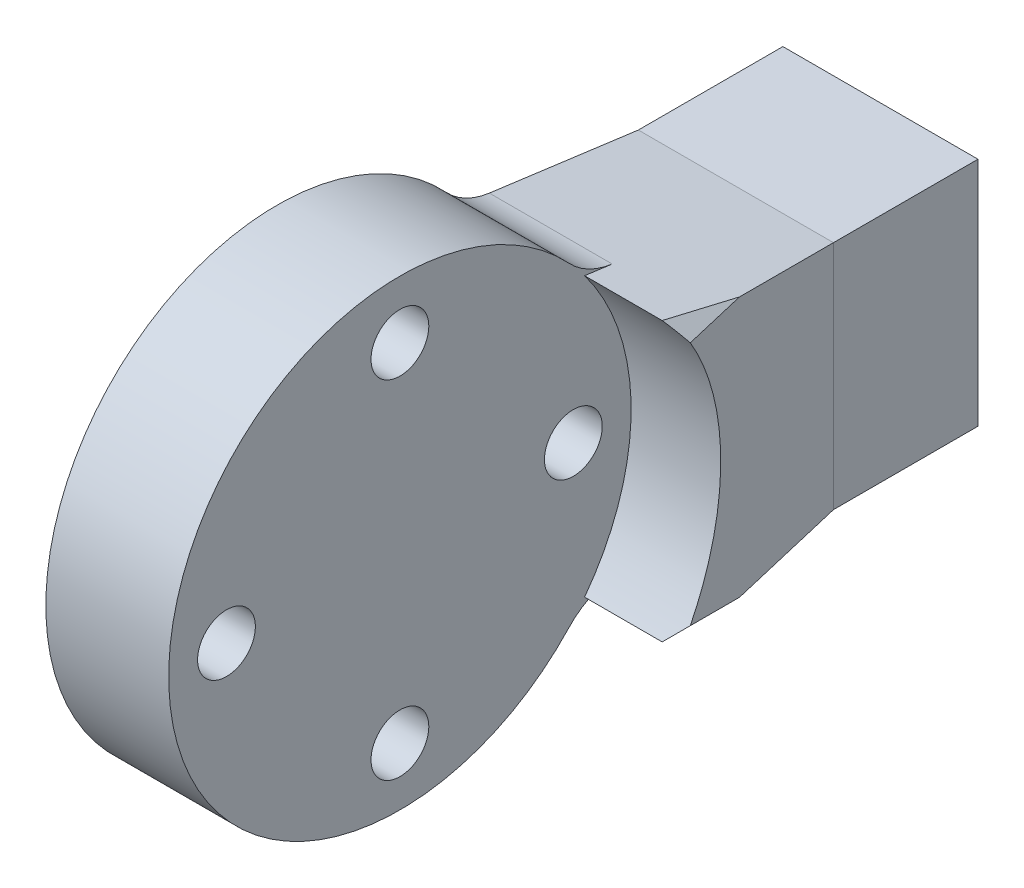
ISO-10303-21;
HEADER;
FILE_DESCRIPTION(('STEP AP214'),'2;1');
FILE_NAME('part.step','',(''),(''),'','','');
FILE_SCHEMA(('AUTOMOTIVE_DESIGN { 1 0 10303 214 1 1 1 1 }'));
ENDSEC;
DATA;
#1=APPLICATION_CONTEXT('core data for automotive mechanical design processes');
#2=APPLICATION_PROTOCOL_DEFINITION('international standard','automotive_design',2000,#1);
#3=PRODUCT_CONTEXT('',#1,'mechanical');
#4=PRODUCT('Part','Part','',(#3));
#5=PRODUCT_RELATED_PRODUCT_CATEGORY('part','',(#4));
#6=PRODUCT_DEFINITION_FORMATION('','',#4);
#7=PRODUCT_DEFINITION_CONTEXT('part definition',#1,'design');
#8=PRODUCT_DEFINITION('design','',#6,#7);
#9=PRODUCT_DEFINITION_SHAPE('','',#8);
#10=(LENGTH_UNIT() NAMED_UNIT(*) SI_UNIT(.MILLI.,.METRE.));
#11=(NAMED_UNIT(*) PLANE_ANGLE_UNIT() SI_UNIT($,.RADIAN.));
#12=(NAMED_UNIT(*) SI_UNIT($,.STERADIAN.) SOLID_ANGLE_UNIT());
#13=UNCERTAINTY_MEASURE_WITH_UNIT(LENGTH_MEASURE(1.E-05),#10,'distance_accuracy_value','');
#14=(GEOMETRIC_REPRESENTATION_CONTEXT(3) GLOBAL_UNCERTAINTY_ASSIGNED_CONTEXT((#13)) GLOBAL_UNIT_ASSIGNED_CONTEXT((#10,
#11,#12)) REPRESENTATION_CONTEXT('',''));
#15=CARTESIAN_POINT('',(0.,0.,0.));
#16=DIRECTION('',(0.,0.,1.));
#17=DIRECTION('',(1.,0.,0.));
#18=AXIS2_PLACEMENT_3D('',#15,#16,#17);
#19=CARTESIAN_POINT('',(16.,10.,-9.99999999999961));
#20=DIRECTION('',(0.,-0.991227900682635,0.132163720091015));
#21=DIRECTION('',(-1.,0.,0.));
#22=AXIS2_PLACEMENT_3D('',#19,#20,#21);
#23=PLANE('',#22);
#24=DIRECTION('',(1.,0.,0.));
#25=VECTOR('',#24,1.);
#26=CARTESIAN_POINT('',(16.,8.,-25.));
#27=LINE('',#26,#25);
#28=CARTESIAN_POINT('',(0.5,8.,-25.));
#29=VERTEX_POINT('',#28);
#30=CARTESIAN_POINT('',(14.,8.,-25.));
#31=VERTEX_POINT('',#30);
#32=EDGE_CURVE('E212',#29,#31,#27,.T.);
#33=ORIENTED_EDGE('',*,*,#32,.F.);
#34=DIRECTION('',(0.,-0.132163720091015,-0.991227900682635));
#35=VECTOR('',#34,1.);
#36=CARTESIAN_POINT('',(0.5,9.37476407572791,-14.6892694320404));
#37=LINE('',#36,#35);
#38=CARTESIAN_POINT('',(0.5,9.37476407572791,-14.6892694320404));
#39=VERTEX_POINT('',#38);
#40=EDGE_CURVE('E275',#39,#29,#37,.T.);
#41=ORIENTED_EDGE('',*,*,#40,.F.);
#42=DIRECTION('',(1.,0.,0.));
#43=VECTOR('',#42,1.);
#44=CARTESIAN_POINT('',(9.,9.37476407572791,-14.6892694320404));
#45=LINE('',#44,#43);
#46=CARTESIAN_POINT('',(9.,9.37476407572791,-14.6892694320404));
#47=VERTEX_POINT('',#46);
#48=EDGE_CURVE('E55',#39,#47,#45,.T.);
#49=ORIENTED_EDGE('',*,*,#48,.T.);
#50=DIRECTION('',(0.,-0.132163720091015,-0.991227900682635));
#51=VECTOR('',#50,1.);
#52=CARTESIAN_POINT('',(9.,11.1353711790392,-1.48471615720519));
#53=LINE('',#52,#51);
#54=CARTESIAN_POINT('',(9.,9.62963758604953,-12.7777181046281));
#55=VERTEX_POINT('',#54);
#56=EDGE_CURVE('E170',#47,#55,#53,.F.);
#57=ORIENTED_EDGE('',*,*,#56,.T.);
#58=DIRECTION('',(1.,0.,0.));
#59=VECTOR('',#58,1.);
#60=CARTESIAN_POINT('',(9.,9.62963758604954,-12.7777181046281));
#61=LINE('',#60,#59);
#62=CARTESIAN_POINT('',(14.3703624139505,9.62963758604954,-12.7777181046282));
#63=VERTEX_POINT('',#62);
#64=EDGE_CURVE('E175',#63,#55,#61,.F.);
#65=ORIENTED_EDGE('',*,*,#64,.F.);
#66=DIRECTION('',(0.13102435641608,-0.131024356416081,-0.982682673120629));
#67=VECTOR('',#66,1.);
#68=CARTESIAN_POINT('',(14.0343347639485,9.9656652360515,-10.2575107296133));
#69=LINE('',#68,#67);
#70=CARTESIAN_POINT('',(15.,9.,-17.4999999999998));
#71=VERTEX_POINT('',#70);
#72=EDGE_CURVE('E218',#63,#71,#69,.T.);
#73=ORIENTED_EDGE('',*,*,#72,.T.);
#74=DIRECTION('',(0.13102435641608,0.13102435641608,0.982682673120628));
#75=VECTOR('',#74,1.);
#76=CARTESIAN_POINT('',(13.862660944206,7.86266094420601,-26.0300429184549));
#77=LINE('',#76,#75);
#78=EDGE_CURVE('E213',#31,#71,#77,.T.);
#79=ORIENTED_EDGE('',*,*,#78,.F.);
#80=EDGE_LOOP('',(#33,#41,#49,#57,#65,#73,#79));
#81=FACE_BOUND('',#80,.T.);
#82=ADVANCED_FACE('F47',(#81),#23,.F.);
#83=CARTESIAN_POINT('',(16.,-8.,-25.));
#84=DIRECTION('',(0.,-0.991227900682635,-0.132163720091015));
#85=DIRECTION('',(1.,0.,0.));
#86=AXIS2_PLACEMENT_3D('',#83,#84,#85);
#87=PLANE('',#86);
#88=DIRECTION('',(-1.,0.,0.));
#89=VECTOR('',#88,1.);
#90=CARTESIAN_POINT('',(0.,-9.37476407572791,-14.6892694320404));
#91=LINE('',#90,#89);
#92=CARTESIAN_POINT('',(9.,-9.37476407572791,-14.6892694320404));
#93=VERTEX_POINT('',#92);
#94=CARTESIAN_POINT('',(0.5,-9.37476407572791,-14.6892694320404));
#95=VERTEX_POINT('',#94);
#96=EDGE_CURVE('E157',#93,#95,#91,.T.);
#97=ORIENTED_EDGE('',*,*,#96,.T.);
#98=DIRECTION('',(0.,-0.132163720091015,0.991227900682635));
#99=VECTOR('',#98,1.);
#100=CARTESIAN_POINT('',(0.5,-8.,-25.));
#101=LINE('',#100,#99);
#102=CARTESIAN_POINT('',(0.5,-8.,-25.));
#103=VERTEX_POINT('',#102);
#104=EDGE_CURVE('E137',#103,#95,#101,.T.);
#105=ORIENTED_EDGE('',*,*,#104,.F.);
#106=DIRECTION('',(-1.,0.,0.));
#107=VECTOR('',#106,1.);
#108=CARTESIAN_POINT('',(0.,-8.,-25.));
#109=LINE('',#108,#107);
#110=CARTESIAN_POINT('',(14.,-8.,-25.));
#111=VERTEX_POINT('',#110);
#112=EDGE_CURVE('E215',#111,#103,#109,.T.);
#113=ORIENTED_EDGE('',*,*,#112,.F.);
#114=DIRECTION('',(0.13102435641608,-0.13102435641608,0.982682673120628));
#115=VECTOR('',#114,1.);
#116=CARTESIAN_POINT('',(13.862660944206,-7.86266094420601,-26.0300429184549));
#117=LINE('',#116,#115);
#118=CARTESIAN_POINT('',(15.,-9.,-17.4999999999998));
#119=VERTEX_POINT('',#118);
#120=EDGE_CURVE('E208',#111,#119,#117,.T.);
#121=ORIENTED_EDGE('',*,*,#120,.T.);
#122=DIRECTION('',(-0.13102435641608,-0.131024356416081,0.982682673120629));
#123=VECTOR('',#122,1.);
#124=CARTESIAN_POINT('',(16.,-8.,-25.));
#125=LINE('',#124,#123);
#126=CARTESIAN_POINT('',(14.3703624139505,-9.62963758604954,-12.7777181046282));
#127=VERTEX_POINT('',#126);
#128=EDGE_CURVE('E224',#119,#127,#125,.T.);
#129=ORIENTED_EDGE('',*,*,#128,.T.);
#130=DIRECTION('',(1.,0.,0.));
#131=VECTOR('',#130,1.);
#132=CARTESIAN_POINT('',(9.,-9.62963758604954,-12.7777181046281));
#133=LINE('',#132,#131);
#134=CARTESIAN_POINT('',(9.,-9.62963758604954,-12.7777181046281));
#135=VERTEX_POINT('',#134);
#136=EDGE_CURVE('E184',#135,#127,#133,.T.);
#137=ORIENTED_EDGE('',*,*,#136,.F.);
#138=DIRECTION('',(0.,0.132163720091015,-0.991227900682635));
#139=VECTOR('',#138,1.);
#140=CARTESIAN_POINT('',(9.,-11.1353711790392,-1.48471615720519));
#141=LINE('',#140,#139);
#142=EDGE_CURVE('E160',#135,#93,#141,.T.);
#143=ORIENTED_EDGE('',*,*,#142,.T.);
#144=EDGE_LOOP('',(#97,#105,#113,#121,#129,#137,#143));
#145=FACE_BOUND('',#144,.T.);
#146=ADVANCED_FACE('F239',(#145),#87,.T.);
#147=CARTESIAN_POINT('',(0.,0.,-35.));
#148=DIRECTION('',(0.,0.,-1.));
#149=DIRECTION('',(-1.,0.,0.));
#150=AXIS2_PLACEMENT_3D('',#147,#148,#149);
#151=PLANE('',#150);
#152=CARTESIAN_POINT('',(8.,0.,-35.));
#153=DIRECTION('',(0.,0.,-1.));
#154=DIRECTION('',(-1.,0.,0.));
#155=AXIS2_PLACEMENT_3D('',#152,#153,#154);
#156=CIRCLE('',#155,4.);
#157=CARTESIAN_POINT('',(4.,0.,-35.));
#158=VERTEX_POINT('',#157);
#159=EDGE_CURVE('E278',#158,#158,#156,.T.);
#160=ORIENTED_EDGE('',*,*,#159,.F.);
#161=EDGE_LOOP('',(#160));
#162=FACE_BOUND('',#161,.T.);
#163=DIRECTION('',(-1.,0.,0.));
#164=VECTOR('',#163,1.);
#165=CARTESIAN_POINT('',(14.,-8.,-35.));
#166=LINE('',#165,#164);
#167=CARTESIAN_POINT('',(14.,-8.,-35.));
#168=VERTEX_POINT('',#167);
#169=CARTESIAN_POINT('',(0.5,-8.,-35.));
#170=VERTEX_POINT('',#169);
#171=EDGE_CURVE('E199',#168,#170,#166,.T.);
#172=ORIENTED_EDGE('',*,*,#171,.T.);
#173=DIRECTION('',(0.,-1.,0.));
#174=VECTOR('',#173,1.);
#175=CARTESIAN_POINT('',(0.5,8.,-35.));
#176=LINE('',#175,#174);
#177=CARTESIAN_POINT('',(0.5,8.,-35.));
#178=VERTEX_POINT('',#177);
#179=EDGE_CURVE('E271',#178,#170,#176,.T.);
#180=ORIENTED_EDGE('',*,*,#179,.F.);
#181=DIRECTION('',(1.,0.,0.));
#182=VECTOR('',#181,1.);
#183=CARTESIAN_POINT('',(0.,8.,-35.));
#184=LINE('',#183,#182);
#185=CARTESIAN_POINT('',(14.,8.,-35.));
#186=VERTEX_POINT('',#185);
#187=EDGE_CURVE('E190',#178,#186,#184,.T.);
#188=ORIENTED_EDGE('',*,*,#187,.T.);
#189=DIRECTION('',(0.,-1.,0.));
#190=VECTOR('',#189,1.);
#191=CARTESIAN_POINT('',(14.,8.,-35.));
#192=LINE('',#191,#190);
#193=EDGE_CURVE('E192',#186,#168,#192,.T.);
#194=ORIENTED_EDGE('',*,*,#193,.T.);
#195=EDGE_LOOP('',(#172,#180,#188,#194));
#196=FACE_BOUND('',#195,.T.);
#197=ADVANCED_FACE('F292',(#162,#196),#151,.T.);
#198=CARTESIAN_POINT('',(0.,8.,-35.));
#199=DIRECTION('',(0.,-1.,0.));
#200=DIRECTION('',(0.,0.,-1.));
#201=AXIS2_PLACEMENT_3D('',#198,#199,#200);
#202=PLANE('',#201);
#203=DIRECTION('',(0.,0.,-1.));
#204=VECTOR('',#203,1.);
#205=CARTESIAN_POINT('',(0.5,8.,-25.));
#206=LINE('',#205,#204);
#207=EDGE_CURVE('E273',#29,#178,#206,.T.);
#208=ORIENTED_EDGE('',*,*,#207,.F.);
#209=ORIENTED_EDGE('',*,*,#32,.T.);
#210=DIRECTION('',(0.,0.,1.));
#211=VECTOR('',#210,1.);
#212=CARTESIAN_POINT('',(14.,8.,-35.));
#213=LINE('',#212,#211);
#214=EDGE_CURVE('E205',#186,#31,#213,.T.);
#215=ORIENTED_EDGE('',*,*,#214,.F.);
#216=ORIENTED_EDGE('',*,*,#187,.F.);
#217=EDGE_LOOP('',(#208,#209,#215,#216));
#218=FACE_BOUND('',#217,.T.);
#219=ADVANCED_FACE('F295',(#218),#202,.F.);
#220=CARTESIAN_POINT('',(14.,-8.,-35.));
#221=DIRECTION('',(0.,1.,0.));
#222=DIRECTION('',(0.,0.,1.));
#223=AXIS2_PLACEMENT_3D('',#220,#221,#222);
#224=PLANE('',#223);
#225=DIRECTION('',(0.,0.,1.));
#226=VECTOR('',#225,1.);
#227=CARTESIAN_POINT('',(0.5,-8.,-35.));
#228=LINE('',#227,#226);
#229=EDGE_CURVE('E269',#170,#103,#228,.T.);
#230=ORIENTED_EDGE('',*,*,#229,.F.);
#231=ORIENTED_EDGE('',*,*,#171,.F.);
#232=DIRECTION('',(0.,0.,1.));
#233=VECTOR('',#232,1.);
#234=CARTESIAN_POINT('',(14.,-8.,-35.));
#235=LINE('',#234,#233);
#236=EDGE_CURVE('E202',#168,#111,#235,.T.);
#237=ORIENTED_EDGE('',*,*,#236,.T.);
#238=ORIENTED_EDGE('',*,*,#112,.T.);
#239=EDGE_LOOP('',(#230,#231,#237,#238));
#240=FACE_BOUND('',#239,.T.);
#241=ADVANCED_FACE('F304',(#240),#224,.F.);
#242=CARTESIAN_POINT('',(-45.254833995939,0.,0.));
#243=DIRECTION('',(1.,0.,0.));
#244=DIRECTION('',(0.,0.,-1.));
#245=AXIS2_PLACEMENT_3D('',#242,#243,#244);
#246=CYLINDRICAL_SURFACE('',#245,16.);
#247=DIRECTION('',(1.,0.,0.));
#248=VECTOR('',#247,1.);
#249=CARTESIAN_POINT('',(-45.254833995939,10.9187836793456,-11.6953051676156));
#250=LINE('',#249,#248);
#251=CARTESIAN_POINT('',(9.,10.9187836793456,-11.6953051676156));
#252=VERTEX_POINT('',#251);
#253=CARTESIAN_POINT('',(0.5,10.9187836793456,-11.6953051676156));
#254=VERTEX_POINT('',#253);
#255=EDGE_CURVE('E151',#252,#254,#250,.F.);
#256=ORIENTED_EDGE('',*,*,#255,.T.);
#257=CARTESIAN_POINT('',(0.5,0.,0.));
#258=DIRECTION('',(-1.,0.,0.));
#259=DIRECTION('',(0.,0.,1.));
#260=AXIS2_PLACEMENT_3D('',#257,#258,#259);
#261=CIRCLE('',#260,16.);
#262=CARTESIAN_POINT('',(0.5,-10.9187836793456,-11.6953051676156));
#263=VERTEX_POINT('',#262);
#264=EDGE_CURVE('E62',#263,#254,#261,.T.);
#265=ORIENTED_EDGE('',*,*,#264,.F.);
#266=DIRECTION('',(1.,0.,0.));
#267=VECTOR('',#266,1.);
#268=CARTESIAN_POINT('',(-45.254833995939,-10.9187836793456,-11.6953051676156));
#269=LINE('',#268,#267);
#270=CARTESIAN_POINT('',(9.,-10.9187836793456,-11.6953051676156));
#271=VERTEX_POINT('',#270);
#272=EDGE_CURVE('E148',#263,#271,#269,.T.);
#273=ORIENTED_EDGE('',*,*,#272,.T.);
#274=CARTESIAN_POINT('',(9.,0.,0.));
#275=DIRECTION('',(1.,0.,0.));
#276=DIRECTION('',(0.,0.,-1.));
#277=AXIS2_PLACEMENT_3D('',#274,#275,#276);
#278=CIRCLE('',#277,16.);
#279=EDGE_CURVE('E185',#252,#271,#278,.T.);
#280=ORIENTED_EDGE('',*,*,#279,.F.);
#281=EDGE_LOOP('',(#256,#265,#273,#280));
#282=FACE_BOUND('',#281,.T.);
#283=ADVANCED_FACE('F146',(#282),#246,.T.);
#284=CARTESIAN_POINT('',(-11.,-12.,0.));
#285=DIRECTION('',(1.,0.,0.));
#286=DIRECTION('',(0.,0.,-1.));
#287=AXIS2_PLACEMENT_3D('',#284,#285,#286);
#288=CYLINDRICAL_SURFACE('',#287,2.);
#289=CARTESIAN_POINT('',(9.,-12.,0.));
#290=DIRECTION('',(1.,0.,0.));
#291=DIRECTION('',(0.,0.,-1.));
#292=AXIS2_PLACEMENT_3D('',#289,#290,#291);
#293=CIRCLE('',#292,2.);
#294=CARTESIAN_POINT('',(9.,-12.,-2.));
#295=VERTEX_POINT('',#294);
#296=EDGE_CURVE('E245',#295,#295,#293,.T.);
#297=ORIENTED_EDGE('',*,*,#296,.T.);
#298=EDGE_LOOP('',(#297));
#299=FACE_BOUND('',#298,.T.);
#300=CARTESIAN_POINT('',(0.5,-12.,0.));
#301=DIRECTION('',(-1.,0.,0.));
#302=DIRECTION('',(0.,0.,1.));
#303=AXIS2_PLACEMENT_3D('',#300,#301,#302);
#304=CIRCLE('',#303,2.);
#305=CARTESIAN_POINT('',(0.5,-12.,2.));
#306=VERTEX_POINT('',#305);
#307=EDGE_CURVE('E249',#306,#306,#304,.F.);
#308=ORIENTED_EDGE('',*,*,#307,.F.);
#309=EDGE_LOOP('',(#308));
#310=FACE_BOUND('',#309,.T.);
#311=ADVANCED_FACE('F355',(#299,#310),#288,.F.);
#312=CARTESIAN_POINT('',(-11.,0.,12.));
#313=DIRECTION('',(1.,0.,0.));
#314=DIRECTION('',(0.,0.,-1.));
#315=AXIS2_PLACEMENT_3D('',#312,#313,#314);
#316=CYLINDRICAL_SURFACE('',#315,2.);
#317=CARTESIAN_POINT('',(9.,0.,12.));
#318=DIRECTION('',(1.,0.,0.));
#319=DIRECTION('',(0.,0.,-1.));
#320=AXIS2_PLACEMENT_3D('',#317,#318,#319);
#321=CIRCLE('',#320,2.);
#322=CARTESIAN_POINT('',(9.,0.,10.));
#323=VERTEX_POINT('',#322);
#324=EDGE_CURVE('E248',#323,#323,#321,.T.);
#325=ORIENTED_EDGE('',*,*,#324,.T.);
#326=EDGE_LOOP('',(#325));
#327=FACE_BOUND('',#326,.T.);
#328=CARTESIAN_POINT('',(0.5,0.,12.));
#329=DIRECTION('',(-1.,0.,0.));
#330=DIRECTION('',(0.,0.,1.));
#331=AXIS2_PLACEMENT_3D('',#328,#329,#330);
#332=CIRCLE('',#331,2.);
#333=CARTESIAN_POINT('',(0.5,0.,14.));
#334=VERTEX_POINT('',#333);
#335=EDGE_CURVE('E259',#334,#334,#332,.F.);
#336=ORIENTED_EDGE('',*,*,#335,.F.);
#337=EDGE_LOOP('',(#336));
#338=FACE_BOUND('',#337,.T.);
#339=ADVANCED_FACE('F347',(#327,#338),#316,.F.);
#340=CARTESIAN_POINT('',(-11.,12.,0.));
#341=DIRECTION('',(1.,0.,0.));
#342=DIRECTION('',(0.,0.,-1.));
#343=AXIS2_PLACEMENT_3D('',#340,#341,#342);
#344=CYLINDRICAL_SURFACE('',#343,2.);
#345=CARTESIAN_POINT('',(9.,12.,0.));
#346=DIRECTION('',(1.,0.,0.));
#347=DIRECTION('',(0.,0.,-1.));
#348=AXIS2_PLACEMENT_3D('',#345,#346,#347);
#349=CIRCLE('',#348,2.);
#350=CARTESIAN_POINT('',(9.,12.,-2.));
#351=VERTEX_POINT('',#350);
#352=EDGE_CURVE('E252',#351,#351,#349,.T.);
#353=ORIENTED_EDGE('',*,*,#352,.T.);
#354=EDGE_LOOP('',(#353));
#355=FACE_BOUND('',#354,.T.);
#356=CARTESIAN_POINT('',(0.5,12.,0.));
#357=DIRECTION('',(-1.,0.,0.));
#358=DIRECTION('',(0.,0.,1.));
#359=AXIS2_PLACEMENT_3D('',#356,#357,#358);
#360=CIRCLE('',#359,2.);
#361=CARTESIAN_POINT('',(0.5,12.,2.));
#362=VERTEX_POINT('',#361);
#363=EDGE_CURVE('E262',#362,#362,#360,.F.);
#364=ORIENTED_EDGE('',*,*,#363,.F.);
#365=EDGE_LOOP('',(#364));
#366=FACE_BOUND('',#365,.T.);
#367=ADVANCED_FACE('F341',(#355,#366),#344,.F.);
#368=CARTESIAN_POINT('',(-11.,0.,-12.));
#369=DIRECTION('',(1.,0.,0.));
#370=DIRECTION('',(0.,0.,-1.));
#371=AXIS2_PLACEMENT_3D('',#368,#369,#370);
#372=CYLINDRICAL_SURFACE('',#371,2.);
#373=CARTESIAN_POINT('',(9.,0.,-12.));
#374=DIRECTION('',(1.,0.,0.));
#375=DIRECTION('',(0.,0.,-1.));
#376=AXIS2_PLACEMENT_3D('',#373,#374,#375);
#377=CIRCLE('',#376,2.);
#378=CARTESIAN_POINT('',(9.,0.,-14.));
#379=VERTEX_POINT('',#378);
#380=EDGE_CURVE('E244',#379,#379,#377,.T.);
#381=ORIENTED_EDGE('',*,*,#380,.T.);
#382=EDGE_LOOP('',(#381));
#383=FACE_BOUND('',#382,.T.);
#384=CARTESIAN_POINT('',(0.5,0.,-12.));
#385=DIRECTION('',(-1.,0.,0.));
#386=DIRECTION('',(0.,0.,1.));
#387=AXIS2_PLACEMENT_3D('',#384,#385,#386);
#388=CIRCLE('',#387,2.);
#389=CARTESIAN_POINT('',(0.5,0.,-10.));
#390=VERTEX_POINT('',#389);
#391=EDGE_CURVE('E265',#390,#390,#388,.F.);
#392=ORIENTED_EDGE('',*,*,#391,.F.);
#393=EDGE_LOOP('',(#392));
#394=FACE_BOUND('',#393,.T.);
#395=ADVANCED_FACE('F336',(#383,#394),#372,.F.);
#396=CARTESIAN_POINT('',(-45.254833995939,-14.3309035791411,-15.3500880324955));
#397=DIRECTION('',(1.,0.,0.));
#398=DIRECTION('',(0.,0.,-1.));
#399=AXIS2_PLACEMENT_3D('',#396,#397,#398);
#400=CYLINDRICAL_SURFACE('',#399,5.);
#401=CARTESIAN_POINT('',(0.5,-14.3309035791411,-15.3500880324955));
#402=DIRECTION('',(1.,0.,0.));
#403=DIRECTION('',(0.,0.,1.));
#404=AXIS2_PLACEMENT_3D('',#401,#402,#403);
#405=CIRCLE('',#404,5.);
#406=EDGE_CURVE('E133',#95,#263,#405,.T.);
#407=ORIENTED_EDGE('',*,*,#406,.F.);
#408=ORIENTED_EDGE('',*,*,#96,.F.);
#409=CARTESIAN_POINT('',(9.,-14.3309035791411,-15.3500880324955));
#410=DIRECTION('',(1.,0.,0.));
#411=DIRECTION('',(0.,0.,-1.));
#412=AXIS2_PLACEMENT_3D('',#409,#410,#411);
#413=CIRCLE('',#412,5.);
#414=EDGE_CURVE('E156',#271,#93,#413,.F.);
#415=ORIENTED_EDGE('',*,*,#414,.F.);
#416=ORIENTED_EDGE('',*,*,#272,.F.);
#417=EDGE_LOOP('',(#407,#408,#415,#416));
#418=FACE_BOUND('',#417,.T.);
#419=ADVANCED_FACE('F155',(#418),#400,.F.);
#420=CARTESIAN_POINT('',(-45.254833995939,14.3309035791411,-15.3500880324955));
#421=DIRECTION('',(1.,0.,0.));
#422=DIRECTION('',(0.,0.,-1.));
#423=AXIS2_PLACEMENT_3D('',#420,#421,#422);
#424=CYLINDRICAL_SURFACE('',#423,5.);
#425=CARTESIAN_POINT('',(0.5,14.3309035791411,-15.3500880324955));
#426=DIRECTION('',(1.,0.,0.));
#427=DIRECTION('',(0.,0.,1.));
#428=AXIS2_PLACEMENT_3D('',#425,#426,#427);
#429=CIRCLE('',#428,5.);
#430=EDGE_CURVE('E152',#254,#39,#429,.T.);
#431=ORIENTED_EDGE('',*,*,#430,.F.);
#432=ORIENTED_EDGE('',*,*,#255,.F.);
#433=CARTESIAN_POINT('',(9.,14.3309035791411,-15.3500880324955));
#434=DIRECTION('',(1.,0.,0.));
#435=DIRECTION('',(0.,0.,-1.));
#436=AXIS2_PLACEMENT_3D('',#433,#434,#435);
#437=CIRCLE('',#436,5.);
#438=EDGE_CURVE('E12',#47,#252,#437,.F.);
#439=ORIENTED_EDGE('',*,*,#438,.F.);
#440=ORIENTED_EDGE('',*,*,#48,.F.);
#441=EDGE_LOOP('',(#431,#432,#439,#440));
#442=FACE_BOUND('',#441,.T.);
#443=ADVANCED_FACE('F49',(#442),#424,.F.);
#444=CARTESIAN_POINT('',(14.,0.,-25.));
#445=DIRECTION('',(-0.991227900682635,0.,0.132163720091015));
#446=DIRECTION('',(0.,-1.,0.));
#447=AXIS2_PLACEMENT_3D('',#444,#445,#446);
#448=PLANE('',#447);
#449=CARTESIAN_POINT('',(17.3333333333333,0.,0.));
#450=DIRECTION('',(-0.991227900682635,0.,0.132163720091015));
#451=DIRECTION('',(0.132163720091015,0.,0.991227900682635));
#452=AXIS2_PLACEMENT_3D('',#449,#450,#451);
#453=ELLIPSE('',#452,16.1415956804497,16.);
#454=CARTESIAN_POINT('',(15.5239432031667,-8.47605679683325,-13.5704259762491));
#455=VERTEX_POINT('',#454);
#456=CARTESIAN_POINT('',(15.5239432031667,8.47605679683325,-13.5704259762491));
#457=VERTEX_POINT('',#456);
#458=EDGE_CURVE('E194',#455,#457,#453,.F.);
#459=ORIENTED_EDGE('',*,*,#458,.F.);
#460=DIRECTION('',(0.13102435641608,0.131024356416081,0.982682673120628));
#461=VECTOR('',#460,1.);
#462=CARTESIAN_POINT('',(14.1716738197425,-9.82832618025752,-23.7124463519314));
#463=LINE('',#462,#461);
#464=EDGE_CURVE('E162',#455,#119,#463,.F.);
#465=ORIENTED_EDGE('',*,*,#464,.T.);
#466=ORIENTED_EDGE('',*,*,#120,.F.);
#467=DIRECTION('',(0.,-1.,0.));
#468=VECTOR('',#467,1.);
#469=CARTESIAN_POINT('',(14.,0.,-25.));
#470=LINE('',#469,#468);
#471=EDGE_CURVE('E209',#31,#111,#470,.T.);
#472=ORIENTED_EDGE('',*,*,#471,.F.);
#473=ORIENTED_EDGE('',*,*,#78,.T.);
#474=DIRECTION('',(0.13102435641608,-0.131024356416081,0.982682673120628));
#475=VECTOR('',#474,1.);
#476=CARTESIAN_POINT('',(14.1716738197425,9.82832618025752,-23.7124463519314));
#477=LINE('',#476,#475);
#478=EDGE_CURVE('E227',#71,#457,#477,.T.);
#479=ORIENTED_EDGE('',*,*,#478,.T.);
#480=EDGE_LOOP('',(#459,#465,#466,#472,#473,#479));
#481=FACE_BOUND('',#480,.T.);
#482=ADVANCED_FACE('F232',(#481),#448,.F.);
#483=CARTESIAN_POINT('',(14.,10.,0.));
#484=DIRECTION('',(-0.707106781186548,-0.707106781186547,0.));
#485=DIRECTION('',(0.,0.,-1.));
#486=AXIS2_PLACEMENT_3D('',#483,#484,#485);
#487=PLANE('',#486);
#488=CARTESIAN_POINT('',(24.,0.,0.));
#489=DIRECTION('',(-0.707106781186548,-0.707106781186547,0.));
#490=DIRECTION('',(0.707106781186547,-0.707106781186548,0.));
#491=AXIS2_PLACEMENT_3D('',#488,#489,#490);
#492=ELLIPSE('',#491,22.6274169979695,16.);
#493=EDGE_CURVE('E189',#457,#63,#492,.F.);
#494=ORIENTED_EDGE('',*,*,#493,.F.);
#495=ORIENTED_EDGE('',*,*,#478,.F.);
#496=ORIENTED_EDGE('',*,*,#72,.F.);
#497=EDGE_LOOP('',(#494,#495,#496));
#498=FACE_BOUND('',#497,.T.);
#499=ADVANCED_FACE('F320',(#498),#487,.F.);
#500=CARTESIAN_POINT('',(16.,-7.99999999999999,0.));
#501=DIRECTION('',(0.707106781186548,-0.707106781186547,0.));
#502=DIRECTION('',(0.,0.,1.));
#503=AXIS2_PLACEMENT_3D('',#500,#501,#502);
#504=PLANE('',#503);
#505=CARTESIAN_POINT('',(24.,0.,0.));
#506=DIRECTION('',(0.707106781186548,-0.707106781186547,0.));
#507=DIRECTION('',(0.707106781186547,0.707106781186548,0.));
#508=AXIS2_PLACEMENT_3D('',#505,#506,#507);
#509=ELLIPSE('',#508,22.6274169979695,16.);
#510=EDGE_CURVE('E158',#127,#455,#509,.T.);
#511=ORIENTED_EDGE('',*,*,#510,.F.);
#512=ORIENTED_EDGE('',*,*,#128,.F.);
#513=ORIENTED_EDGE('',*,*,#464,.F.);
#514=EDGE_LOOP('',(#511,#512,#513));
#515=FACE_BOUND('',#514,.T.);
#516=ADVANCED_FACE('F240',(#515),#504,.T.);
#517=CARTESIAN_POINT('',(14.,8.,-35.));
#518=DIRECTION('',(-1.,0.,0.));
#519=DIRECTION('',(0.,0.,1.));
#520=AXIS2_PLACEMENT_3D('',#517,#518,#519);
#521=PLANE('',#520);
#522=ORIENTED_EDGE('',*,*,#471,.T.);
#523=ORIENTED_EDGE('',*,*,#236,.F.);
#524=ORIENTED_EDGE('',*,*,#193,.F.);
#525=ORIENTED_EDGE('',*,*,#214,.T.);
#526=EDGE_LOOP('',(#522,#523,#524,#525));
#527=FACE_BOUND('',#526,.T.);
#528=ADVANCED_FACE('F311',(#527),#521,.F.);
#529=CARTESIAN_POINT('',(9.,0.,0.));
#530=DIRECTION('',(1.,0.,0.));
#531=DIRECTION('',(0.,0.,-1.));
#532=AXIS2_PLACEMENT_3D('',#529,#530,#531);
#533=CYLINDRICAL_SURFACE('',#532,16.);
#534=ORIENTED_EDGE('',*,*,#64,.T.);
#535=CARTESIAN_POINT('',(9.,0.,0.));
#536=DIRECTION('',(1.,0.,0.));
#537=DIRECTION('',(0.,0.,-1.));
#538=AXIS2_PLACEMENT_3D('',#535,#536,#537);
#539=CIRCLE('',#538,16.);
#540=EDGE_CURVE('E180',#135,#55,#539,.T.);
#541=ORIENTED_EDGE('',*,*,#540,.F.);
#542=ORIENTED_EDGE('',*,*,#136,.T.);
#543=ORIENTED_EDGE('',*,*,#510,.T.);
#544=ORIENTED_EDGE('',*,*,#458,.T.);
#545=ORIENTED_EDGE('',*,*,#493,.T.);
#546=EDGE_LOOP('',(#534,#541,#542,#543,#544,#545));
#547=FACE_BOUND('',#546,.T.);
#548=ADVANCED_FACE('F187',(#547),#533,.F.);
#549=CARTESIAN_POINT('',(9.,0.,0.));
#550=DIRECTION('',(1.,0.,0.));
#551=DIRECTION('',(0.,0.,-1.));
#552=AXIS2_PLACEMENT_3D('',#549,#550,#551);
#553=PLANE('',#552);
#554=ORIENTED_EDGE('',*,*,#380,.F.);
#555=EDGE_LOOP('',(#554));
#556=FACE_BOUND('',#555,.T.);
#557=ORIENTED_EDGE('',*,*,#352,.F.);
#558=EDGE_LOOP('',(#557));
#559=FACE_BOUND('',#558,.T.);
#560=ORIENTED_EDGE('',*,*,#324,.F.);
#561=EDGE_LOOP('',(#560));
#562=FACE_BOUND('',#561,.T.);
#563=ORIENTED_EDGE('',*,*,#296,.F.);
#564=EDGE_LOOP('',(#563));
#565=FACE_BOUND('',#564,.T.);
#566=ORIENTED_EDGE('',*,*,#540,.T.);
#567=ORIENTED_EDGE('',*,*,#56,.F.);
#568=ORIENTED_EDGE('',*,*,#438,.T.);
#569=ORIENTED_EDGE('',*,*,#279,.T.);
#570=ORIENTED_EDGE('',*,*,#414,.T.);
#571=ORIENTED_EDGE('',*,*,#142,.F.);
#572=EDGE_LOOP('',(#566,#567,#568,#569,#570,#571));
#573=FACE_BOUND('',#572,.T.);
#574=ADVANCED_FACE('F181',(#556,#559,#562,#565,#573),#553,.T.);
#575=CARTESIAN_POINT('',(0.5,-14.3309035791411,-15.3500880324955));
#576=DIRECTION('',(-1.,0.,0.));
#577=DIRECTION('',(0.,0.,1.));
#578=AXIS2_PLACEMENT_3D('',#575,#576,#577);
#579=PLANE('',#578);
#580=ORIENTED_EDGE('',*,*,#406,.T.);
#581=ORIENTED_EDGE('',*,*,#264,.T.);
#582=ORIENTED_EDGE('',*,*,#430,.T.);
#583=ORIENTED_EDGE('',*,*,#40,.T.);
#584=ORIENTED_EDGE('',*,*,#207,.T.);
#585=ORIENTED_EDGE('',*,*,#179,.T.);
#586=ORIENTED_EDGE('',*,*,#229,.T.);
#587=ORIENTED_EDGE('',*,*,#104,.T.);
#588=EDGE_LOOP('',(#580,#581,#582,#583,#584,#585,#586,#587));
#589=FACE_BOUND('',#588,.T.);
#590=ORIENTED_EDGE('',*,*,#391,.T.);
#591=EDGE_LOOP('',(#590));
#592=FACE_BOUND('',#591,.T.);
#593=ORIENTED_EDGE('',*,*,#363,.T.);
#594=EDGE_LOOP('',(#593));
#595=FACE_BOUND('',#594,.T.);
#596=ORIENTED_EDGE('',*,*,#335,.T.);
#597=EDGE_LOOP('',(#596));
#598=FACE_BOUND('',#597,.T.);
#599=ORIENTED_EDGE('',*,*,#307,.T.);
#600=EDGE_LOOP('',(#599));
#601=FACE_BOUND('',#600,.T.);
#602=ADVANCED_FACE('F134',(#589,#592,#595,#598,#601),#579,.T.);
#603=CARTESIAN_POINT('',(8.,0.,-20.));
#604=DIRECTION('',(0.,0.,-1.));
#605=DIRECTION('',(-1.,0.,0.));
#606=AXIS2_PLACEMENT_3D('',#603,#604,#605);
#607=CYLINDRICAL_SURFACE('',#606,4.);
#608=CARTESIAN_POINT('',(8.,0.,-20.));
#609=DIRECTION('',(0.,0.,-1.));
#610=DIRECTION('',(-1.,0.,0.));
#611=AXIS2_PLACEMENT_3D('',#608,#609,#610);
#612=CIRCLE('',#611,4.);
#613=CARTESIAN_POINT('',(4.,0.,-20.));
#614=VERTEX_POINT('',#613);
#615=EDGE_CURVE('E142',#614,#614,#612,.T.);
#616=ORIENTED_EDGE('',*,*,#615,.F.);
#617=EDGE_LOOP('',(#616));
#618=FACE_BOUND('',#617,.T.);
#619=ORIENTED_EDGE('',*,*,#159,.T.);
#620=EDGE_LOOP('',(#619));
#621=FACE_BOUND('',#620,.T.);
#622=ADVANCED_FACE('F286',(#618,#621),#607,.F.);
#623=CARTESIAN_POINT('',(8.,0.,-20.));
#624=DIRECTION('',(0.,0.,-1.));
#625=DIRECTION('',(-1.,0.,0.));
#626=AXIS2_PLACEMENT_3D('',#623,#624,#625);
#627=PLANE('',#626);
#628=ORIENTED_EDGE('',*,*,#615,.T.);
#629=EDGE_LOOP('',(#628));
#630=FACE_BOUND('',#629,.T.);
#631=ADVANCED_FACE('F284',(#630),#627,.T.);
#632=CLOSED_SHELL('',(#82,#146,#197,#219,#241,#283,#311,#339,#367,#395,#419,#443,#482,#499,#516,
#528,#548,#574,#602,#622,#631));
#633=MANIFOLD_SOLID_BREP('B2',#632);
#634=ADVANCED_BREP_SHAPE_REPRESENTATION('',(#18,#633),#14);
#635=SHAPE_DEFINITION_REPRESENTATION(#9,#634);
ENDSEC;
END-ISO-10303-21;
